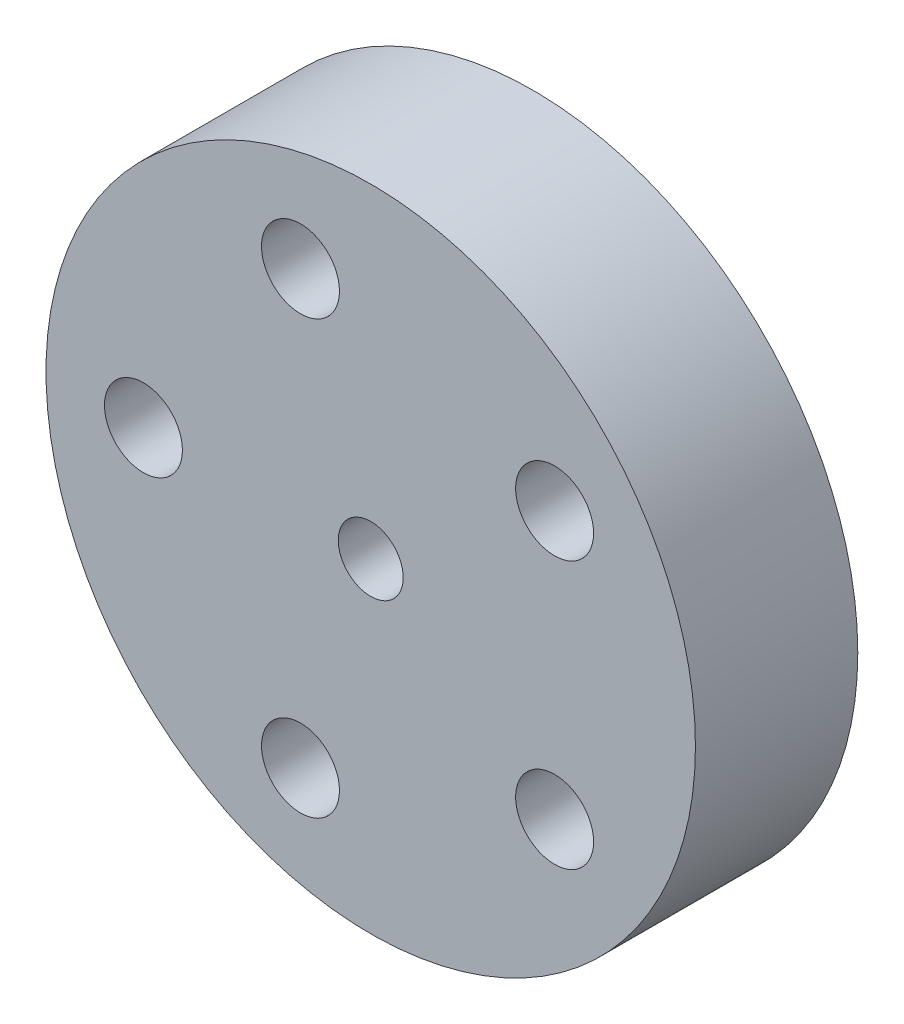
ISO-10303-21;
HEADER;
FILE_DESCRIPTION(('STEP AP214'),'2;1');
FILE_NAME('part.step','',(''),(''),'','','');
FILE_SCHEMA(('AUTOMOTIVE_DESIGN { 1 0 10303 214 1 1 1 1 }'));
ENDSEC;
DATA;
#1=APPLICATION_CONTEXT('core data for automotive mechanical design processes');
#2=APPLICATION_PROTOCOL_DEFINITION('international standard','automotive_design',2000,#1);
#3=PRODUCT_CONTEXT('',#1,'mechanical');
#4=PRODUCT('Part','Part','',(#3));
#5=PRODUCT_RELATED_PRODUCT_CATEGORY('part','',(#4));
#6=PRODUCT_DEFINITION_FORMATION('','',#4);
#7=PRODUCT_DEFINITION_CONTEXT('part definition',#1,'design');
#8=PRODUCT_DEFINITION('design','',#6,#7);
#9=PRODUCT_DEFINITION_SHAPE('','',#8);
#10=(LENGTH_UNIT() NAMED_UNIT(*) SI_UNIT(.MILLI.,.METRE.));
#11=(NAMED_UNIT(*) PLANE_ANGLE_UNIT() SI_UNIT($,.RADIAN.));
#12=(NAMED_UNIT(*) SI_UNIT($,.STERADIAN.) SOLID_ANGLE_UNIT());
#13=UNCERTAINTY_MEASURE_WITH_UNIT(LENGTH_MEASURE(1.E-05),#10,'distance_accuracy_value','');
#14=(GEOMETRIC_REPRESENTATION_CONTEXT(3) GLOBAL_UNCERTAINTY_ASSIGNED_CONTEXT((#13)) GLOBAL_UNIT_ASSIGNED_CONTEXT((#10,
#11,#12)) REPRESENTATION_CONTEXT('',''));
#15=CARTESIAN_POINT('',(0.,0.,0.));
#16=DIRECTION('',(0.,0.,1.));
#17=DIRECTION('',(1.,0.,0.));
#18=AXIS2_PLACEMENT_3D('',#15,#16,#17);
#19=CARTESIAN_POINT('',(0.,0.,3.175));
#20=DIRECTION('',(0.,0.,1.));
#21=DIRECTION('',(1.,0.,0.));
#22=AXIS2_PLACEMENT_3D('',#19,#20,#21);
#23=PLANE('',#22);
#24=CARTESIAN_POINT('',(-4.445,0.,3.175));
#25=DIRECTION('',(0.,0.,1.));
#26=DIRECTION('',(1.,0.,0.));
#27=AXIS2_PLACEMENT_3D('',#24,#25,#26);
#28=CIRCLE('',#27,0.762);
#29=CARTESIAN_POINT('',(-3.683,0.,3.175));
#30=VERTEX_POINT('',#29);
#31=EDGE_CURVE('E73',#30,#30,#28,.T.);
#32=ORIENTED_EDGE('',*,*,#31,.F.);
#33=EDGE_LOOP('',(#32));
#34=FACE_BOUND('',#33,.T.);
#35=CARTESIAN_POINT('',(-1.37358053999663,4.22744621493196,3.175));
#36=DIRECTION('',(0.,0.,1.));
#37=DIRECTION('',(1.,0.,0.));
#38=AXIS2_PLACEMENT_3D('',#35,#36,#37);
#39=CIRCLE('',#38,0.762000000000001);
#40=CARTESIAN_POINT('',(-0.611580539996628,4.22744621493196,3.175));
#41=VERTEX_POINT('',#40);
#42=EDGE_CURVE('E67',#41,#41,#39,.T.);
#43=ORIENTED_EDGE('',*,*,#42,.F.);
#44=EDGE_LOOP('',(#43));
#45=FACE_BOUND('',#44,.T.);
#46=CARTESIAN_POINT('',(3.59608053999666,2.61270544644002,3.175));
#47=DIRECTION('',(0.,0.,1.));
#48=DIRECTION('',(1.,0.,0.));
#49=AXIS2_PLACEMENT_3D('',#46,#47,#48);
#50=CIRCLE('',#49,0.762);
#51=CARTESIAN_POINT('',(4.35808053999666,2.61270544644002,3.175));
#52=VERTEX_POINT('',#51);
#53=EDGE_CURVE('E61',#52,#52,#50,.T.);
#54=ORIENTED_EDGE('',*,*,#53,.F.);
#55=EDGE_LOOP('',(#54));
#56=FACE_BOUND('',#55,.T.);
#57=CARTESIAN_POINT('',(3.59608053999662,-2.61270544644008,3.175));
#58=DIRECTION('',(0.,0.,1.));
#59=DIRECTION('',(1.,0.,0.));
#60=AXIS2_PLACEMENT_3D('',#57,#58,#59);
#61=CIRCLE('',#60,0.762);
#62=CARTESIAN_POINT('',(4.35808053999662,-2.61270544644008,3.175));
#63=VERTEX_POINT('',#62);
#64=EDGE_CURVE('E55',#63,#63,#61,.T.);
#65=ORIENTED_EDGE('',*,*,#64,.F.);
#66=EDGE_LOOP('',(#65));
#67=FACE_BOUND('',#66,.T.);
#68=CARTESIAN_POINT('',(-1.37358053999669,-4.22744621493194,3.175));
#69=DIRECTION('',(0.,0.,1.));
#70=DIRECTION('',(1.,0.,0.));
#71=AXIS2_PLACEMENT_3D('',#68,#69,#70);
#72=CIRCLE('',#71,0.762);
#73=CARTESIAN_POINT('',(-0.611580539996689,-4.22744621493194,3.175));
#74=VERTEX_POINT('',#73);
#75=EDGE_CURVE('E49',#74,#74,#72,.T.);
#76=ORIENTED_EDGE('',*,*,#75,.F.);
#77=EDGE_LOOP('',(#76));
#78=FACE_BOUND('',#77,.T.);
#79=CARTESIAN_POINT('',(0.,0.,3.175));
#80=DIRECTION('',(0.,0.,1.));
#81=DIRECTION('',(1.,0.,0.));
#82=AXIS2_PLACEMENT_3D('',#79,#80,#81);
#83=CIRCLE('',#82,6.35);
#84=CARTESIAN_POINT('',(6.35,0.,3.175));
#85=VERTEX_POINT('',#84);
#86=EDGE_CURVE('E10',#85,#85,#83,.T.);
#87=ORIENTED_EDGE('',*,*,#86,.T.);
#88=EDGE_LOOP('',(#87));
#89=FACE_BOUND('',#88,.T.);
#90=CARTESIAN_POINT('',(0.,0.,3.175));
#91=DIRECTION('',(0.,0.,1.));
#92=DIRECTION('',(1.,0.,0.));
#93=AXIS2_PLACEMENT_3D('',#90,#91,#92);
#94=CIRCLE('',#93,0.635);
#95=CARTESIAN_POINT('',(0.635,0.,3.175));
#96=VERTEX_POINT('',#95);
#97=EDGE_CURVE('E41',#96,#96,#94,.T.);
#98=ORIENTED_EDGE('',*,*,#97,.F.);
#99=EDGE_LOOP('',(#98));
#100=FACE_BOUND('',#99,.T.);
#101=ADVANCED_FACE('F30',(#34,#45,#56,#67,#78,#89,#100),#23,.T.);
#102=CARTESIAN_POINT('',(0.,0.,0.));
#103=DIRECTION('',(0.,0.,1.));
#104=DIRECTION('',(1.,0.,0.));
#105=AXIS2_PLACEMENT_3D('',#102,#103,#104);
#106=PLANE('',#105);
#107=CARTESIAN_POINT('',(-4.445,0.,0.));
#108=DIRECTION('',(0.,0.,1.));
#109=DIRECTION('',(1.,0.,0.));
#110=AXIS2_PLACEMENT_3D('',#107,#108,#109);
#111=CIRCLE('',#110,0.762);
#112=CARTESIAN_POINT('',(-3.683,0.,0.));
#113=VERTEX_POINT('',#112);
#114=EDGE_CURVE('E46',#113,#113,#111,.T.);
#115=ORIENTED_EDGE('',*,*,#114,.T.);
#116=EDGE_LOOP('',(#115));
#117=FACE_BOUND('',#116,.T.);
#118=CARTESIAN_POINT('',(-1.37358053999663,4.22744621493196,0.));
#119=DIRECTION('',(0.,0.,1.));
#120=DIRECTION('',(1.,0.,0.));
#121=AXIS2_PLACEMENT_3D('',#118,#119,#120);
#122=CIRCLE('',#121,0.762000000000001);
#123=CARTESIAN_POINT('',(-0.611580539996628,4.22744621493196,0.));
#124=VERTEX_POINT('',#123);
#125=EDGE_CURVE('E70',#124,#124,#122,.T.);
#126=ORIENTED_EDGE('',*,*,#125,.T.);
#127=EDGE_LOOP('',(#126));
#128=FACE_BOUND('',#127,.T.);
#129=CARTESIAN_POINT('',(3.59608053999666,2.61270544644002,0.));
#130=DIRECTION('',(0.,0.,1.));
#131=DIRECTION('',(1.,0.,0.));
#132=AXIS2_PLACEMENT_3D('',#129,#130,#131);
#133=CIRCLE('',#132,0.762);
#134=CARTESIAN_POINT('',(4.35808053999666,2.61270544644002,0.));
#135=VERTEX_POINT('',#134);
#136=EDGE_CURVE('E64',#135,#135,#133,.T.);
#137=ORIENTED_EDGE('',*,*,#136,.T.);
#138=EDGE_LOOP('',(#137));
#139=FACE_BOUND('',#138,.T.);
#140=CARTESIAN_POINT('',(3.59608053999662,-2.61270544644008,0.));
#141=DIRECTION('',(0.,0.,1.));
#142=DIRECTION('',(1.,0.,0.));
#143=AXIS2_PLACEMENT_3D('',#140,#141,#142);
#144=CIRCLE('',#143,0.762);
#145=CARTESIAN_POINT('',(4.35808053999662,-2.61270544644008,0.));
#146=VERTEX_POINT('',#145);
#147=EDGE_CURVE('E58',#146,#146,#144,.T.);
#148=ORIENTED_EDGE('',*,*,#147,.T.);
#149=EDGE_LOOP('',(#148));
#150=FACE_BOUND('',#149,.T.);
#151=CARTESIAN_POINT('',(-1.37358053999669,-4.22744621493194,0.));
#152=DIRECTION('',(0.,0.,1.));
#153=DIRECTION('',(1.,0.,0.));
#154=AXIS2_PLACEMENT_3D('',#151,#152,#153);
#155=CIRCLE('',#154,0.762);
#156=CARTESIAN_POINT('',(-0.611580539996689,-4.22744621493194,0.));
#157=VERTEX_POINT('',#156);
#158=EDGE_CURVE('E52',#157,#157,#155,.T.);
#159=ORIENTED_EDGE('',*,*,#158,.T.);
#160=EDGE_LOOP('',(#159));
#161=FACE_BOUND('',#160,.T.);
#162=CARTESIAN_POINT('',(0.,0.,0.));
#163=DIRECTION('',(0.,0.,1.));
#164=DIRECTION('',(1.,0.,0.));
#165=AXIS2_PLACEMENT_3D('',#162,#163,#164);
#166=CIRCLE('',#165,6.35);
#167=CARTESIAN_POINT('',(6.35,0.,0.));
#168=VERTEX_POINT('',#167);
#169=EDGE_CURVE('E34',#168,#168,#166,.T.);
#170=ORIENTED_EDGE('',*,*,#169,.F.);
#171=EDGE_LOOP('',(#170));
#172=FACE_BOUND('',#171,.T.);
#173=CARTESIAN_POINT('',(0.,0.,0.));
#174=DIRECTION('',(0.,0.,1.));
#175=DIRECTION('',(1.,0.,0.));
#176=AXIS2_PLACEMENT_3D('',#173,#174,#175);
#177=CIRCLE('',#176,0.635);
#178=CARTESIAN_POINT('',(0.635,0.,0.));
#179=VERTEX_POINT('',#178);
#180=EDGE_CURVE('E43',#179,#179,#177,.T.);
#181=ORIENTED_EDGE('',*,*,#180,.T.);
#182=EDGE_LOOP('',(#181));
#183=FACE_BOUND('',#182,.T.);
#184=ADVANCED_FACE('F79',(#117,#128,#139,#150,#161,#172,#183),#106,.F.);
#185=CARTESIAN_POINT('',(0.,0.,3.175));
#186=DIRECTION('',(0.,0.,-1.));
#187=DIRECTION('',(-1.,0.,0.));
#188=AXIS2_PLACEMENT_3D('',#185,#186,#187);
#189=CYLINDRICAL_SURFACE('',#188,6.35);
#190=ORIENTED_EDGE('',*,*,#86,.F.);
#191=EDGE_LOOP('',(#190));
#192=FACE_BOUND('',#191,.T.);
#193=ORIENTED_EDGE('',*,*,#169,.T.);
#194=EDGE_LOOP('',(#193));
#195=FACE_BOUND('',#194,.T.);
#196=ADVANCED_FACE('F32',(#192,#195),#189,.T.);
#197=CARTESIAN_POINT('',(0.,0.,3.175));
#198=DIRECTION('',(0.,0.,-1.));
#199=DIRECTION('',(-1.,0.,0.));
#200=AXIS2_PLACEMENT_3D('',#197,#198,#199);
#201=CYLINDRICAL_SURFACE('',#200,0.635);
#202=ORIENTED_EDGE('',*,*,#97,.T.);
#203=EDGE_LOOP('',(#202));
#204=FACE_BOUND('',#203,.T.);
#205=ORIENTED_EDGE('',*,*,#180,.F.);
#206=EDGE_LOOP('',(#205));
#207=FACE_BOUND('',#206,.T.);
#208=ADVANCED_FACE('F102',(#204,#207),#201,.F.);
#209=CARTESIAN_POINT('',(-1.37358053999669,-4.22744621493194,0.));
#210=DIRECTION('',(0.,0.,1.));
#211=DIRECTION('',(1.,0.,0.));
#212=AXIS2_PLACEMENT_3D('',#209,#210,#211);
#213=CYLINDRICAL_SURFACE('',#212,0.762);
#214=ORIENTED_EDGE('',*,*,#158,.F.);
#215=EDGE_LOOP('',(#214));
#216=FACE_BOUND('',#215,.T.);
#217=ORIENTED_EDGE('',*,*,#75,.T.);
#218=EDGE_LOOP('',(#217));
#219=FACE_BOUND('',#218,.T.);
#220=ADVANCED_FACE('F105',(#216,#219),#213,.F.);
#221=CARTESIAN_POINT('',(3.59608053999662,-2.61270544644008,0.));
#222=DIRECTION('',(0.,0.,1.));
#223=DIRECTION('',(1.,0.,0.));
#224=AXIS2_PLACEMENT_3D('',#221,#222,#223);
#225=CYLINDRICAL_SURFACE('',#224,0.762);
#226=ORIENTED_EDGE('',*,*,#147,.F.);
#227=EDGE_LOOP('',(#226));
#228=FACE_BOUND('',#227,.T.);
#229=ORIENTED_EDGE('',*,*,#64,.T.);
#230=EDGE_LOOP('',(#229));
#231=FACE_BOUND('',#230,.T.);
#232=ADVANCED_FACE('F117',(#228,#231),#225,.F.);
#233=CARTESIAN_POINT('',(3.59608053999666,2.61270544644002,0.));
#234=DIRECTION('',(0.,0.,1.));
#235=DIRECTION('',(1.,0.,0.));
#236=AXIS2_PLACEMENT_3D('',#233,#234,#235);
#237=CYLINDRICAL_SURFACE('',#236,0.762);
#238=ORIENTED_EDGE('',*,*,#136,.F.);
#239=EDGE_LOOP('',(#238));
#240=FACE_BOUND('',#239,.T.);
#241=ORIENTED_EDGE('',*,*,#53,.T.);
#242=EDGE_LOOP('',(#241));
#243=FACE_BOUND('',#242,.T.);
#244=ADVANCED_FACE('F121',(#240,#243),#237,.F.);
#245=CARTESIAN_POINT('',(-1.37358053999663,4.22744621493196,0.));
#246=DIRECTION('',(0.,0.,1.));
#247=DIRECTION('',(1.,0.,0.));
#248=AXIS2_PLACEMENT_3D('',#245,#246,#247);
#249=CYLINDRICAL_SURFACE('',#248,0.762000000000001);
#250=ORIENTED_EDGE('',*,*,#125,.F.);
#251=EDGE_LOOP('',(#250));
#252=FACE_BOUND('',#251,.T.);
#253=ORIENTED_EDGE('',*,*,#42,.T.);
#254=EDGE_LOOP('',(#253));
#255=FACE_BOUND('',#254,.T.);
#256=ADVANCED_FACE('F85',(#252,#255),#249,.F.);
#257=CARTESIAN_POINT('',(-4.445,0.,0.));
#258=DIRECTION('',(0.,0.,1.));
#259=DIRECTION('',(1.,0.,0.));
#260=AXIS2_PLACEMENT_3D('',#257,#258,#259);
#261=CYLINDRICAL_SURFACE('',#260,0.762);
#262=ORIENTED_EDGE('',*,*,#114,.F.);
#263=EDGE_LOOP('',(#262));
#264=FACE_BOUND('',#263,.T.);
#265=ORIENTED_EDGE('',*,*,#31,.T.);
#266=EDGE_LOOP('',(#265));
#267=FACE_BOUND('',#266,.T.);
#268=ADVANCED_FACE('F82',(#264,#267),#261,.F.);
#269=CLOSED_SHELL('',(#101,#184,#196,#208,#220,#232,#244,#256,#268));
#270=MANIFOLD_SOLID_BREP('B2',#269);
#271=ADVANCED_BREP_SHAPE_REPRESENTATION('',(#18,#270),#14);
#272=SHAPE_DEFINITION_REPRESENTATION(#9,#271);
ENDSEC;
END-ISO-10303-21;
